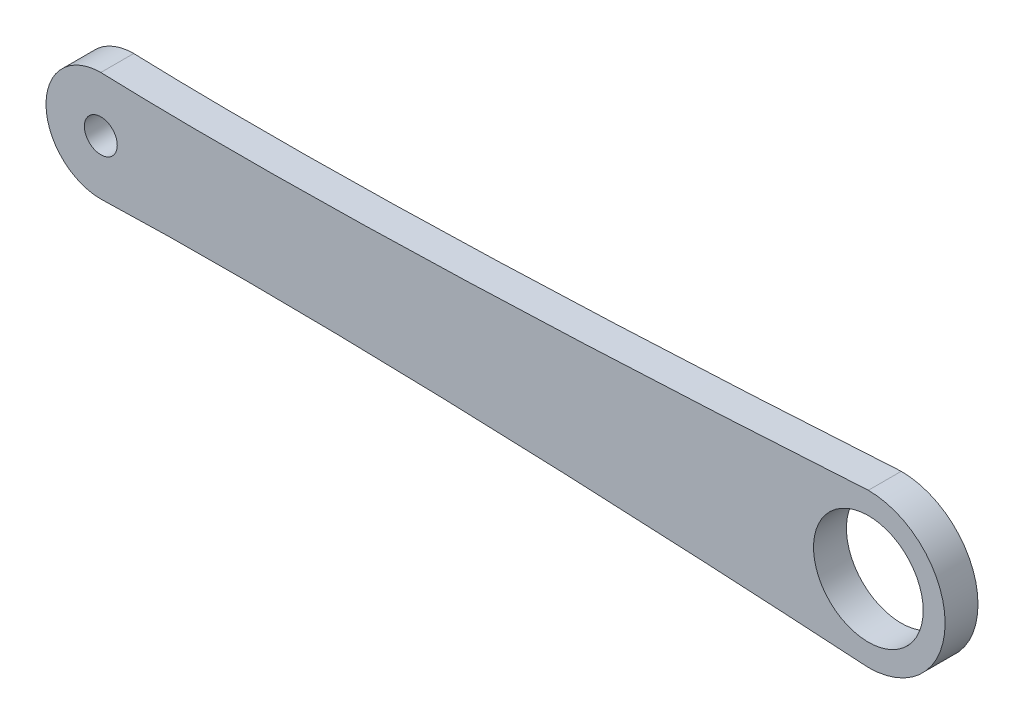
ISO-10303-21;
HEADER;
FILE_DESCRIPTION(('STEP AP214'),'2;1');
FILE_NAME('part.step','',(''),(''),'','','');
FILE_SCHEMA(('AUTOMOTIVE_DESIGN { 1 0 10303 214 1 1 1 1 }'));
ENDSEC;
DATA;
#1=APPLICATION_CONTEXT('core data for automotive mechanical design processes');
#2=APPLICATION_PROTOCOL_DEFINITION('international standard','automotive_design',2000,#1);
#3=PRODUCT_CONTEXT('',#1,'mechanical');
#4=PRODUCT('Part','Part','',(#3));
#5=PRODUCT_RELATED_PRODUCT_CATEGORY('part','',(#4));
#6=PRODUCT_DEFINITION_FORMATION('','',#4);
#7=PRODUCT_DEFINITION_CONTEXT('part definition',#1,'design');
#8=PRODUCT_DEFINITION('design','',#6,#7);
#9=PRODUCT_DEFINITION_SHAPE('','',#8);
#10=(LENGTH_UNIT() NAMED_UNIT(*) SI_UNIT(.MILLI.,.METRE.));
#11=(NAMED_UNIT(*) PLANE_ANGLE_UNIT() SI_UNIT($,.RADIAN.));
#12=(NAMED_UNIT(*) SI_UNIT($,.STERADIAN.) SOLID_ANGLE_UNIT());
#13=UNCERTAINTY_MEASURE_WITH_UNIT(LENGTH_MEASURE(1.E-05),#10,'distance_accuracy_value','');
#14=(GEOMETRIC_REPRESENTATION_CONTEXT(3) GLOBAL_UNCERTAINTY_ASSIGNED_CONTEXT((#13)) GLOBAL_UNIT_ASSIGNED_CONTEXT((#10,
#11,#12)) REPRESENTATION_CONTEXT('',''));
#15=CARTESIAN_POINT('',(0.,0.,0.));
#16=DIRECTION('',(0.,0.,1.));
#17=DIRECTION('',(1.,0.,0.));
#18=AXIS2_PLACEMENT_3D('',#15,#16,#17);
#19=CARTESIAN_POINT('',(29.5476511175222,5.08576452523223,3.));
#20=DIRECTION('',(0.,0.,-1.));
#21=DIRECTION('',(-1.,0.,0.));
#22=AXIS2_PLACEMENT_3D('',#19,#20,#21);
#23=PLANE('',#22);
#24=CARTESIAN_POINT('',(70.,7.,3.));
#25=CARTESIAN_POINT('',(24.0953022350443,4.17152905046445,3.));
#26=CARTESIAN_POINT('',(0.,5.,3.));
#27=B_SPLINE_CURVE_WITH_KNOTS('',2,(#24,#25,#26),.UNSPECIFIED.,.F.,.F.,(3,3),(0.,1.),.UNSPECIFIED.);
#28=CARTESIAN_POINT('',(70.,7.,3.));
#29=VERTEX_POINT('',#28);
#30=CARTESIAN_POINT('',(0.,5.,3.));
#31=VERTEX_POINT('',#30);
#32=EDGE_CURVE('E87',#29,#31,#27,.T.);
#33=ORIENTED_EDGE('',*,*,#32,.T.);
#34=CARTESIAN_POINT('',(0.,0.,3.));
#35=DIRECTION('',(0.,0.,1.));
#36=DIRECTION('',(1.,0.,0.));
#37=AXIS2_PLACEMENT_3D('',#34,#35,#36);
#38=CIRCLE('',#37,5.);
#39=CARTESIAN_POINT('',(0.,-5.,3.));
#40=VERTEX_POINT('',#39);
#41=EDGE_CURVE('E82',#31,#40,#38,.T.);
#42=ORIENTED_EDGE('',*,*,#41,.T.);
#43=CARTESIAN_POINT('',(0.,-5.,3.));
#44=CARTESIAN_POINT('',(24.0953022350443,-4.17152905046445,3.));
#45=CARTESIAN_POINT('',(70.,-7.,3.));
#46=B_SPLINE_CURVE_WITH_KNOTS('',2,(#43,#44,#45),.UNSPECIFIED.,.F.,.F.,(3,3),(0.,1.),.UNSPECIFIED.);
#47=CARTESIAN_POINT('',(70.,-7.,3.));
#48=VERTEX_POINT('',#47);
#49=EDGE_CURVE('E85',#40,#48,#46,.T.);
#50=ORIENTED_EDGE('',*,*,#49,.T.);
#51=CARTESIAN_POINT('',(70.,0.,3.));
#52=DIRECTION('',(0.,0.,1.));
#53=DIRECTION('',(1.,0.,0.));
#54=AXIS2_PLACEMENT_3D('',#51,#52,#53);
#55=CIRCLE('',#54,7.);
#56=EDGE_CURVE('E52',#48,#29,#55,.T.);
#57=ORIENTED_EDGE('',*,*,#56,.T.);
#58=EDGE_LOOP('',(#33,#42,#50,#57));
#59=FACE_BOUND('',#58,.T.);
#60=CARTESIAN_POINT('',(70.,0.,3.));
#61=DIRECTION('',(0.,0.,1.));
#62=DIRECTION('',(1.,0.,0.));
#63=AXIS2_PLACEMENT_3D('',#60,#61,#62);
#64=CIRCLE('',#63,5.);
#65=CARTESIAN_POINT('',(75.,0.,3.));
#66=VERTEX_POINT('',#65);
#67=EDGE_CURVE('E143',#66,#66,#64,.T.);
#68=ORIENTED_EDGE('',*,*,#67,.F.);
#69=EDGE_LOOP('',(#68));
#70=FACE_BOUND('',#69,.T.);
#71=CARTESIAN_POINT('',(0.,0.,3.));
#72=DIRECTION('',(0.,0.,1.));
#73=DIRECTION('',(1.,0.,0.));
#74=AXIS2_PLACEMENT_3D('',#71,#72,#73);
#75=CIRCLE('',#74,1.5);
#76=CARTESIAN_POINT('',(1.5,0.,3.));
#77=VERTEX_POINT('',#76);
#78=EDGE_CURVE('E134',#77,#77,#75,.T.);
#79=ORIENTED_EDGE('',*,*,#78,.F.);
#80=EDGE_LOOP('',(#79));
#81=FACE_BOUND('',#80,.T.);
#82=ADVANCED_FACE('F34',(#59,#70,#81),#23,.F.);
#83=CARTESIAN_POINT('',(29.5476511175222,5.08576452523223,0.));
#84=DIRECTION('',(0.,0.,-1.));
#85=DIRECTION('',(-1.,0.,0.));
#86=AXIS2_PLACEMENT_3D('',#83,#84,#85);
#87=PLANE('',#86);
#88=CARTESIAN_POINT('',(70.,0.,0.));
#89=DIRECTION('',(0.,0.,1.));
#90=DIRECTION('',(1.,0.,0.));
#91=AXIS2_PLACEMENT_3D('',#88,#89,#90);
#92=CIRCLE('',#91,5.);
#93=CARTESIAN_POINT('',(75.,0.,0.));
#94=VERTEX_POINT('',#93);
#95=EDGE_CURVE('E140',#94,#94,#92,.T.);
#96=ORIENTED_EDGE('',*,*,#95,.T.);
#97=EDGE_LOOP('',(#96));
#98=FACE_BOUND('',#97,.T.);
#99=CARTESIAN_POINT('',(70.,7.,0.));
#100=CARTESIAN_POINT('',(24.0953022350443,4.17152905046445,0.));
#101=CARTESIAN_POINT('',(0.,5.,0.));
#102=B_SPLINE_CURVE_WITH_KNOTS('',2,(#99,#100,#101),.UNSPECIFIED.,.F.,.F.,(3,3),(0.,1.),.UNSPECIFIED.);
#103=CARTESIAN_POINT('',(70.,7.,0.));
#104=VERTEX_POINT('',#103);
#105=CARTESIAN_POINT('',(0.,5.,0.));
#106=VERTEX_POINT('',#105);
#107=EDGE_CURVE('E146',#104,#106,#102,.T.);
#108=ORIENTED_EDGE('',*,*,#107,.F.);
#109=CARTESIAN_POINT('',(70.,0.,0.));
#110=DIRECTION('',(0.,0.,1.));
#111=DIRECTION('',(1.,0.,0.));
#112=AXIS2_PLACEMENT_3D('',#109,#110,#111);
#113=CIRCLE('',#112,7.);
#114=CARTESIAN_POINT('',(70.,-7.,0.));
#115=VERTEX_POINT('',#114);
#116=EDGE_CURVE('E75',#115,#104,#113,.T.);
#117=ORIENTED_EDGE('',*,*,#116,.F.);
#118=CARTESIAN_POINT('',(0.,-5.,0.));
#119=CARTESIAN_POINT('',(24.0953022350443,-4.17152905046445,0.));
#120=CARTESIAN_POINT('',(70.,-7.,0.));
#121=B_SPLINE_CURVE_WITH_KNOTS('',2,(#118,#119,#120),.UNSPECIFIED.,.F.,.F.,(3,3),(0.,1.),.UNSPECIFIED.);
#122=CARTESIAN_POINT('',(0.,-5.,0.));
#123=VERTEX_POINT('',#122);
#124=EDGE_CURVE('E69',#123,#115,#121,.T.);
#125=ORIENTED_EDGE('',*,*,#124,.F.);
#126=CARTESIAN_POINT('',(0.,0.,0.));
#127=DIRECTION('',(0.,0.,1.));
#128=DIRECTION('',(1.,0.,0.));
#129=AXIS2_PLACEMENT_3D('',#126,#127,#128);
#130=CIRCLE('',#129,5.);
#131=EDGE_CURVE('E91',#106,#123,#130,.T.);
#132=ORIENTED_EDGE('',*,*,#131,.F.);
#133=EDGE_LOOP('',(#108,#117,#125,#132));
#134=FACE_BOUND('',#133,.T.);
#135=CARTESIAN_POINT('',(0.,0.,0.));
#136=DIRECTION('',(0.,0.,1.));
#137=DIRECTION('',(1.,0.,0.));
#138=AXIS2_PLACEMENT_3D('',#135,#136,#137);
#139=CIRCLE('',#138,1.5);
#140=CARTESIAN_POINT('',(1.5,0.,0.));
#141=VERTEX_POINT('',#140);
#142=EDGE_CURVE('E137',#141,#141,#139,.T.);
#143=ORIENTED_EDGE('',*,*,#142,.T.);
#144=EDGE_LOOP('',(#143));
#145=FACE_BOUND('',#144,.T.);
#146=ADVANCED_FACE('F113',(#98,#134,#145),#87,.T.);
#147=DIRECTION('',(0.,0.,-1.));
#148=VECTOR('',#147,1.);
#149=SURFACE_OF_LINEAR_EXTRUSION('',#27,#148);
#150=ORIENTED_EDGE('',*,*,#107,.T.);
#151=DIRECTION('',(0.,0.,-1.));
#152=VECTOR('',#151,1.);
#153=CARTESIAN_POINT('',(0.,5.,3.));
#154=LINE('',#153,#152);
#155=EDGE_CURVE('E11',#31,#106,#154,.T.);
#156=ORIENTED_EDGE('',*,*,#155,.F.);
#157=ORIENTED_EDGE('',*,*,#32,.F.);
#158=DIRECTION('',(0.,0.,-1.));
#159=VECTOR('',#158,1.);
#160=CARTESIAN_POINT('',(70.,7.,3.));
#161=LINE('',#160,#159);
#162=EDGE_CURVE('E95',#29,#104,#161,.T.);
#163=ORIENTED_EDGE('',*,*,#162,.T.);
#164=EDGE_LOOP('',(#150,#156,#157,#163));
#165=FACE_BOUND('',#164,.T.);
#166=ADVANCED_FACE('F36',(#165),#149,.F.);
#167=CARTESIAN_POINT('',(0.,0.,3.));
#168=DIRECTION('',(0.,0.,-1.));
#169=DIRECTION('',(-1.,0.,0.));
#170=AXIS2_PLACEMENT_3D('',#167,#168,#169);
#171=CYLINDRICAL_SURFACE('',#170,5.);
#172=ORIENTED_EDGE('',*,*,#131,.T.);
#173=DIRECTION('',(0.,0.,-1.));
#174=VECTOR('',#173,1.);
#175=CARTESIAN_POINT('',(0.,-5.,3.));
#176=LINE('',#175,#174);
#177=EDGE_CURVE('E44',#40,#123,#176,.T.);
#178=ORIENTED_EDGE('',*,*,#177,.F.);
#179=ORIENTED_EDGE('',*,*,#41,.F.);
#180=ORIENTED_EDGE('',*,*,#155,.T.);
#181=EDGE_LOOP('',(#172,#178,#179,#180));
#182=FACE_BOUND('',#181,.T.);
#183=ADVANCED_FACE('F90',(#182),#171,.T.);
#184=DIRECTION('',(0.,0.,-1.));
#185=VECTOR('',#184,1.);
#186=SURFACE_OF_LINEAR_EXTRUSION('',#46,#185);
#187=ORIENTED_EDGE('',*,*,#124,.T.);
#188=DIRECTION('',(0.,0.,-1.));
#189=VECTOR('',#188,1.);
#190=CARTESIAN_POINT('',(70.,-7.,3.));
#191=LINE('',#190,#189);
#192=EDGE_CURVE('E92',#48,#115,#191,.T.);
#193=ORIENTED_EDGE('',*,*,#192,.F.);
#194=ORIENTED_EDGE('',*,*,#49,.F.);
#195=ORIENTED_EDGE('',*,*,#177,.T.);
#196=EDGE_LOOP('',(#187,#193,#194,#195));
#197=FACE_BOUND('',#196,.T.);
#198=ADVANCED_FACE('F93',(#197),#186,.F.);
#199=CARTESIAN_POINT('',(70.,0.,3.));
#200=DIRECTION('',(0.,0.,-1.));
#201=DIRECTION('',(-1.,0.,0.));
#202=AXIS2_PLACEMENT_3D('',#199,#200,#201);
#203=CYLINDRICAL_SURFACE('',#202,7.);
#204=ORIENTED_EDGE('',*,*,#116,.T.);
#205=ORIENTED_EDGE('',*,*,#162,.F.);
#206=ORIENTED_EDGE('',*,*,#56,.F.);
#207=ORIENTED_EDGE('',*,*,#192,.T.);
#208=EDGE_LOOP('',(#204,#205,#206,#207));
#209=FACE_BOUND('',#208,.T.);
#210=ADVANCED_FACE('F107',(#209),#203,.T.);
#211=CARTESIAN_POINT('',(70.,0.,3.));
#212=DIRECTION('',(0.,0.,-1.));
#213=DIRECTION('',(-1.,0.,0.));
#214=AXIS2_PLACEMENT_3D('',#211,#212,#213);
#215=CYLINDRICAL_SURFACE('',#214,5.);
#216=ORIENTED_EDGE('',*,*,#67,.T.);
#217=EDGE_LOOP('',(#216));
#218=FACE_BOUND('',#217,.T.);
#219=ORIENTED_EDGE('',*,*,#95,.F.);
#220=EDGE_LOOP('',(#219));
#221=FACE_BOUND('',#220,.T.);
#222=ADVANCED_FACE('F122',(#218,#221),#215,.F.);
#223=CARTESIAN_POINT('',(0.,0.,3.));
#224=DIRECTION('',(0.,0.,-1.));
#225=DIRECTION('',(-1.,0.,0.));
#226=AXIS2_PLACEMENT_3D('',#223,#224,#225);
#227=CYLINDRICAL_SURFACE('',#226,1.5);
#228=ORIENTED_EDGE('',*,*,#78,.T.);
#229=EDGE_LOOP('',(#228));
#230=FACE_BOUND('',#229,.T.);
#231=ORIENTED_EDGE('',*,*,#142,.F.);
#232=EDGE_LOOP('',(#231));
#233=FACE_BOUND('',#232,.T.);
#234=ADVANCED_FACE('F125',(#230,#233),#227,.F.);
#235=CLOSED_SHELL('',(#82,#146,#166,#183,#198,#210,#222,#234));
#236=MANIFOLD_SOLID_BREP('B2',#235);
#237=ADVANCED_BREP_SHAPE_REPRESENTATION('',(#18,#236),#14);
#238=SHAPE_DEFINITION_REPRESENTATION(#9,#237);
ENDSEC;
END-ISO-10303-21;
